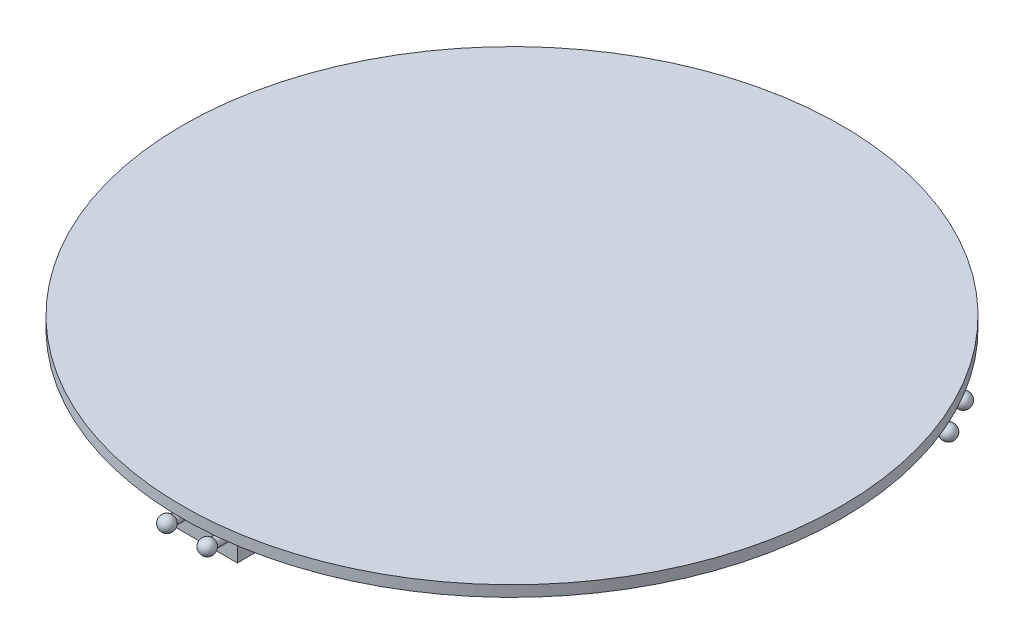
ISO-10303-21;
HEADER;
FILE_DESCRIPTION(('STEP AP214'),'2;1');
FILE_NAME('part.step','',(''),(''),'','','');
FILE_SCHEMA(('AUTOMOTIVE_DESIGN { 1 0 10303 214 1 1 1 1 }'));
ENDSEC;
DATA;
#1=APPLICATION_CONTEXT('core data for automotive mechanical design processes');
#2=APPLICATION_PROTOCOL_DEFINITION('international standard','automotive_design',2000,#1);
#3=PRODUCT_CONTEXT('',#1,'mechanical');
#4=PRODUCT('Part','Part','',(#3));
#5=PRODUCT_RELATED_PRODUCT_CATEGORY('part','',(#4));
#6=PRODUCT_DEFINITION_FORMATION('','',#4);
#7=PRODUCT_DEFINITION_CONTEXT('part definition',#1,'design');
#8=PRODUCT_DEFINITION('design','',#6,#7);
#9=PRODUCT_DEFINITION_SHAPE('','',#8);
#10=(LENGTH_UNIT() NAMED_UNIT(*) SI_UNIT(.MILLI.,.METRE.));
#11=(NAMED_UNIT(*) PLANE_ANGLE_UNIT() SI_UNIT($,.RADIAN.));
#12=(NAMED_UNIT(*) SI_UNIT($,.STERADIAN.) SOLID_ANGLE_UNIT());
#13=UNCERTAINTY_MEASURE_WITH_UNIT(LENGTH_MEASURE(1.E-05),#10,'distance_accuracy_value','');
#14=(GEOMETRIC_REPRESENTATION_CONTEXT(3) GLOBAL_UNCERTAINTY_ASSIGNED_CONTEXT((#13)) GLOBAL_UNIT_ASSIGNED_CONTEXT((#10,
#11,#12)) REPRESENTATION_CONTEXT('',''));
#15=CARTESIAN_POINT('',(0.,0.,0.));
#16=DIRECTION('',(0.,0.,1.));
#17=DIRECTION('',(1.,0.,0.));
#18=AXIS2_PLACEMENT_3D('',#15,#16,#17);
#19=CARTESIAN_POINT('',(0.,0.,0.));
#20=DIRECTION('',(0.,1.,0.));
#21=DIRECTION('',(1.,0.,0.));
#22=AXIS2_PLACEMENT_3D('',#19,#20,#21);
#23=PLANE('',#22);
#24=DIRECTION('',(0.,0.,-1.));
#25=VECTOR('',#24,1.);
#26=CARTESIAN_POINT('',(9.,0.,37.5));
#27=LINE('',#26,#25);
#28=CARTESIAN_POINT('',(9.,0.,84.));
#29=VERTEX_POINT('',#28);
#30=CARTESIAN_POINT('',(9.,0.,75.));
#31=VERTEX_POINT('',#30);
#32=EDGE_CURVE('E440',#29,#31,#27,.T.);
#33=ORIENTED_EDGE('',*,*,#32,.T.);
#34=DIRECTION('',(-1.,0.,0.));
#35=VECTOR('',#34,1.);
#36=CARTESIAN_POINT('',(-4.5,0.,75.));
#37=LINE('',#36,#35);
#38=CARTESIAN_POINT('',(-9.,0.,75.));
#39=VERTEX_POINT('',#38);
#40=EDGE_CURVE('E429',#31,#39,#37,.T.);
#41=ORIENTED_EDGE('',*,*,#40,.T.);
#42=DIRECTION('',(0.,0.,1.));
#43=VECTOR('',#42,1.);
#44=CARTESIAN_POINT('',(-9.,0.,42.));
#45=LINE('',#44,#43);
#46=CARTESIAN_POINT('',(-9.,0.,84.));
#47=VERTEX_POINT('',#46);
#48=EDGE_CURVE('E458',#39,#47,#45,.T.);
#49=ORIENTED_EDGE('',*,*,#48,.T.);
#50=DIRECTION('',(1.,0.,0.));
#51=VECTOR('',#50,1.);
#52=CARTESIAN_POINT('',(4.5,0.,84.));
#53=LINE('',#52,#51);
#54=EDGE_CURVE('E466',#47,#29,#53,.T.);
#55=ORIENTED_EDGE('',*,*,#54,.T.);
#56=EDGE_LOOP('',(#33,#41,#49,#55));
#57=FACE_BOUND('',#56,.T.);
#58=DIRECTION('',(-0.866025403784439,0.,-0.5));
#59=VECTOR('',#58,1.);
#60=CARTESIAN_POINT('',(-31.8730669589464,0.,-28.7942286340599));
#61=LINE('',#60,#59);
#62=CARTESIAN_POINT('',(-60.4519052838329,0.,-45.2942286340599));
#63=VERTEX_POINT('',#62);
#64=CARTESIAN_POINT('',(-68.2461339178929,0.,-49.7942286340599));
#65=VERTEX_POINT('',#64);
#66=EDGE_CURVE('E324',#63,#65,#61,.T.);
#67=ORIENTED_EDGE('',*,*,#66,.T.);
#68=DIRECTION('',(-0.5,0.,0.866025403784439));
#69=VECTOR('',#68,1.);
#70=CARTESIAN_POINT('',(-74.9961339178929,0.,-38.10288568297));
#71=LINE('',#70,#69);
#72=CARTESIAN_POINT('',(-77.2461339178929,0.,-34.20577136594));
#73=VERTEX_POINT('',#72);
#74=EDGE_CURVE('E403',#65,#73,#71,.T.);
#75=ORIENTED_EDGE('',*,*,#74,.T.);
#76=DIRECTION('',(0.866025403784439,0.,0.5));
#77=VECTOR('',#76,1.);
#78=CARTESIAN_POINT('',(-36.9759526419165,0.,-10.95577136594));
#79=LINE('',#78,#77);
#80=CARTESIAN_POINT('',(-69.4519052838329,0.,-29.70577136594));
#81=VERTEX_POINT('',#80);
#82=EDGE_CURVE('E411',#73,#81,#79,.T.);
#83=ORIENTED_EDGE('',*,*,#82,.T.);
#84=DIRECTION('',(0.5,0.,-0.866025403784439));
#85=VECTOR('',#84,1.);
#86=CARTESIAN_POINT('',(-62.7019052838329,0.,-41.3971143170299));
#87=LINE('',#86,#85);
#88=EDGE_CURVE('E422',#81,#63,#87,.T.);
#89=ORIENTED_EDGE('',*,*,#88,.T.);
#90=EDGE_LOOP('',(#67,#75,#83,#89));
#91=FACE_BOUND('',#90,.T.);
#92=DIRECTION('',(-0.866025403784439,0.,0.5));
#93=VECTOR('',#92,1.);
#94=CARTESIAN_POINT('',(27.9759526419163,0.,-26.5442286340602));
#95=LINE('',#94,#93);
#96=CARTESIAN_POINT('',(68.2461339178927,0.,-49.7942286340602));
#97=VERTEX_POINT('',#96);
#98=CARTESIAN_POINT('',(60.4519052838328,0.,-45.2942286340602));
#99=VERTEX_POINT('',#98);
#100=EDGE_CURVE('E342',#97,#99,#95,.T.);
#101=ORIENTED_EDGE('',*,*,#100,.T.);
#102=DIRECTION('',(0.5,0.,0.866025403784438));
#103=VECTOR('',#102,1.);
#104=CARTESIAN_POINT('',(67.2019052838329,0.,-33.60288568297));
#105=LINE('',#104,#103);
#106=CARTESIAN_POINT('',(69.4519052838329,0.,-29.70577136594));
#107=VERTEX_POINT('',#106);
#108=EDGE_CURVE('E358',#99,#107,#105,.T.);
#109=ORIENTED_EDGE('',*,*,#108,.T.);
#110=DIRECTION('',(0.866025403784439,0.,-0.5));
#111=VECTOR('',#110,1.);
#112=CARTESIAN_POINT('',(40.8730669589465,0.,-13.20577136594));
#113=LINE('',#112,#111);
#114=CARTESIAN_POINT('',(77.2461339178929,0.,-34.20577136594));
#115=VERTEX_POINT('',#114);
#116=EDGE_CURVE('E371',#107,#115,#113,.T.);
#117=ORIENTED_EDGE('',*,*,#116,.T.);
#118=DIRECTION('',(-0.5,0.,-0.866025403784438));
#119=VECTOR('',#118,1.);
#120=CARTESIAN_POINT('',(70.4961339178928,0.,-45.8971143170301));
#121=LINE('',#120,#119);
#122=EDGE_CURVE('E326',#115,#97,#121,.T.);
#123=ORIENTED_EDGE('',*,*,#122,.T.);
#124=EDGE_LOOP('',(#101,#109,#117,#123));
#125=FACE_BOUND('',#124,.T.);
#126=CARTESIAN_POINT('',(0.,0.,0.));
#127=DIRECTION('',(0.,1.,0.));
#128=DIRECTION('',(-1.,0.,0.));
#129=AXIS2_PLACEMENT_3D('',#126,#127,#128);
#130=CIRCLE('',#129,90.);
#131=CARTESIAN_POINT('',(90.,0.,0.));
#132=VERTEX_POINT('',#131);
#133=EDGE_CURVE('E11',#132,#132,#130,.T.);
#134=ORIENTED_EDGE('',*,*,#133,.F.);
#135=EDGE_LOOP('',(#134));
#136=FACE_BOUND('',#135,.T.);
#137=ADVANCED_FACE('F17',(#57,#91,#125,#136),#23,.F.);
#138=CARTESIAN_POINT('',(0.,3.,0.));
#139=DIRECTION('',(0.,1.,0.));
#140=DIRECTION('',(1.,0.,0.));
#141=AXIS2_PLACEMENT_3D('',#138,#139,#140);
#142=PLANE('',#141);
#143=CARTESIAN_POINT('',(0.,3.,0.));
#144=DIRECTION('',(0.,1.,0.));
#145=DIRECTION('',(-1.,0.,0.));
#146=AXIS2_PLACEMENT_3D('',#143,#144,#145);
#147=CIRCLE('',#146,90.);
#148=CARTESIAN_POINT('',(90.,3.,0.));
#149=VERTEX_POINT('',#148);
#150=EDGE_CURVE('E392',#149,#149,#147,.T.);
#151=ORIENTED_EDGE('',*,*,#150,.T.);
#152=EDGE_LOOP('',(#151));
#153=FACE_BOUND('',#152,.T.);
#154=ADVANCED_FACE('F476',(#153),#142,.T.);
#155=CARTESIAN_POINT('',(0.,0.,0.));
#156=DIRECTION('',(0.,1.,0.));
#157=DIRECTION('',(-1.,0.,0.));
#158=AXIS2_PLACEMENT_3D('',#155,#156,#157);
#159=CYLINDRICAL_SURFACE('',#158,90.);
#160=ORIENTED_EDGE('',*,*,#150,.F.);
#161=DIRECTION('',(0.,-1.,0.));
#162=VECTOR('',#161,1.);
#163=CARTESIAN_POINT('',(90.,0.,0.));
#164=LINE('',#163,#162);
#165=EDGE_CURVE('E25',#149,#132,#164,.T.);
#166=ORIENTED_EDGE('',*,*,#165,.T.);
#167=ORIENTED_EDGE('',*,*,#133,.T.);
#168=ORIENTED_EDGE('',*,*,#165,.F.);
#169=EDGE_LOOP('',(#160,#166,#167,#168));
#170=FACE_BOUND('',#169,.T.);
#171=ADVANCED_FACE('F478',(#170),#159,.T.);
#172=CARTESIAN_POINT('',(0.,-9.,79.5));
#173=DIRECTION('',(0.,-1.,0.));
#174=DIRECTION('',(0.,0.,-1.));
#175=AXIS2_PLACEMENT_3D('',#172,#173,#174);
#176=PLANE('',#175);
#177=DIRECTION('',(-1.,0.,0.));
#178=VECTOR('',#177,1.);
#179=CARTESIAN_POINT('',(-9.,-9.,84.));
#180=LINE('',#179,#178);
#181=CARTESIAN_POINT('',(9.,-9.,84.));
#182=VERTEX_POINT('',#181);
#183=CARTESIAN_POINT('',(-9.,-9.,84.));
#184=VERTEX_POINT('',#183);
#185=EDGE_CURVE('E395',#182,#184,#180,.T.);
#186=ORIENTED_EDGE('',*,*,#185,.T.);
#187=DIRECTION('',(0.,0.,-1.));
#188=VECTOR('',#187,1.);
#189=CARTESIAN_POINT('',(-9.,-9.,75.));
#190=LINE('',#189,#188);
#191=CARTESIAN_POINT('',(-9.,-9.,75.));
#192=VERTEX_POINT('',#191);
#193=EDGE_CURVE('E465',#184,#192,#190,.T.);
#194=ORIENTED_EDGE('',*,*,#193,.T.);
#195=DIRECTION('',(1.,0.,0.));
#196=VECTOR('',#195,1.);
#197=CARTESIAN_POINT('',(9.,-9.,75.));
#198=LINE('',#197,#196);
#199=CARTESIAN_POINT('',(9.,-9.,75.));
#200=VERTEX_POINT('',#199);
#201=EDGE_CURVE('E451',#192,#200,#198,.T.);
#202=ORIENTED_EDGE('',*,*,#201,.T.);
#203=DIRECTION('',(0.,0.,1.));
#204=VECTOR('',#203,1.);
#205=CARTESIAN_POINT('',(9.,-9.,84.));
#206=LINE('',#205,#204);
#207=EDGE_CURVE('E431',#200,#182,#206,.T.);
#208=ORIENTED_EDGE('',*,*,#207,.T.);
#209=EDGE_LOOP('',(#186,#194,#202,#208));
#210=FACE_BOUND('',#209,.T.);
#211=ADVANCED_FACE('F486',(#210),#176,.T.);
#212=CARTESIAN_POINT('',(9.,0.,84.));
#213=DIRECTION('',(0.,0.,1.));
#214=DIRECTION('',(1.,0.,0.));
#215=AXIS2_PLACEMENT_3D('',#212,#213,#214);
#216=PLANE('',#215);
#217=CARTESIAN_POINT('',(-5.5,-4.5,84.));
#218=DIRECTION('',(0.,0.,-1.));
#219=DIRECTION('',(1.,0.,0.));
#220=AXIS2_PLACEMENT_3D('',#217,#218,#219);
#221=CIRCLE('',#220,1.25);
#222=CARTESIAN_POINT('',(-6.75,-4.5,84.));
#223=VERTEX_POINT('',#222);
#224=EDGE_CURVE('E341',#223,#223,#221,.T.);
#225=ORIENTED_EDGE('',*,*,#224,.T.);
#226=EDGE_LOOP('',(#225));
#227=FACE_BOUND('',#226,.T.);
#228=CARTESIAN_POINT('',(5.5,-4.5,84.));
#229=DIRECTION('',(0.,0.,-1.));
#230=DIRECTION('',(1.,0.,0.));
#231=AXIS2_PLACEMENT_3D('',#228,#229,#230);
#232=CIRCLE('',#231,1.25);
#233=CARTESIAN_POINT('',(4.25,-4.5,84.));
#234=VERTEX_POINT('',#233);
#235=EDGE_CURVE('E331',#234,#234,#232,.T.);
#236=ORIENTED_EDGE('',*,*,#235,.T.);
#237=EDGE_LOOP('',(#236));
#238=FACE_BOUND('',#237,.T.);
#239=ORIENTED_EDGE('',*,*,#54,.F.);
#240=DIRECTION('',(0.,-1.,0.));
#241=VECTOR('',#240,1.);
#242=CARTESIAN_POINT('',(-9.,0.,84.));
#243=LINE('',#242,#241);
#244=EDGE_CURVE('E464',#47,#184,#243,.T.);
#245=ORIENTED_EDGE('',*,*,#244,.T.);
#246=ORIENTED_EDGE('',*,*,#185,.F.);
#247=DIRECTION('',(0.,-1.,0.));
#248=VECTOR('',#247,1.);
#249=CARTESIAN_POINT('',(9.,0.,84.));
#250=LINE('',#249,#248);
#251=EDGE_CURVE('E442',#29,#182,#250,.T.);
#252=ORIENTED_EDGE('',*,*,#251,.F.);
#253=EDGE_LOOP('',(#239,#245,#246,#252));
#254=FACE_BOUND('',#253,.T.);
#255=ADVANCED_FACE('F495',(#227,#238,#254),#216,.T.);
#256=CARTESIAN_POINT('',(-9.,0.,84.));
#257=DIRECTION('',(-1.,0.,0.));
#258=DIRECTION('',(0.,0.,1.));
#259=AXIS2_PLACEMENT_3D('',#256,#257,#258);
#260=PLANE('',#259);
#261=ORIENTED_EDGE('',*,*,#48,.F.);
#262=DIRECTION('',(0.,-1.,0.));
#263=VECTOR('',#262,1.);
#264=CARTESIAN_POINT('',(-9.,0.,75.));
#265=LINE('',#264,#263);
#266=EDGE_CURVE('E452',#39,#192,#265,.T.);
#267=ORIENTED_EDGE('',*,*,#266,.T.);
#268=ORIENTED_EDGE('',*,*,#193,.F.);
#269=ORIENTED_EDGE('',*,*,#244,.F.);
#270=EDGE_LOOP('',(#261,#267,#268,#269));
#271=FACE_BOUND('',#270,.T.);
#272=ADVANCED_FACE('F497',(#271),#260,.T.);
#273=CARTESIAN_POINT('',(-9.,0.,75.));
#274=DIRECTION('',(0.,0.,-1.));
#275=DIRECTION('',(0.,-1.,0.));
#276=AXIS2_PLACEMENT_3D('',#273,#274,#275);
#277=PLANE('',#276);
#278=ORIENTED_EDGE('',*,*,#40,.F.);
#279=DIRECTION('',(0.,-1.,0.));
#280=VECTOR('',#279,1.);
#281=CARTESIAN_POINT('',(9.,0.,75.));
#282=LINE('',#281,#280);
#283=EDGE_CURVE('E426',#31,#200,#282,.T.);
#284=ORIENTED_EDGE('',*,*,#283,.T.);
#285=ORIENTED_EDGE('',*,*,#201,.F.);
#286=ORIENTED_EDGE('',*,*,#266,.F.);
#287=EDGE_LOOP('',(#278,#284,#285,#286));
#288=FACE_BOUND('',#287,.T.);
#289=ADVANCED_FACE('F498',(#288),#277,.T.);
#290=CARTESIAN_POINT('',(9.,0.,75.));
#291=DIRECTION('',(1.,0.,0.));
#292=DIRECTION('',(0.,1.,0.));
#293=AXIS2_PLACEMENT_3D('',#290,#291,#292);
#294=PLANE('',#293);
#295=ORIENTED_EDGE('',*,*,#32,.F.);
#296=ORIENTED_EDGE('',*,*,#251,.T.);
#297=ORIENTED_EDGE('',*,*,#207,.F.);
#298=ORIENTED_EDGE('',*,*,#283,.F.);
#299=EDGE_LOOP('',(#295,#296,#297,#298));
#300=FACE_BOUND('',#299,.T.);
#301=ADVANCED_FACE('F503',(#300),#294,.T.);
#302=CARTESIAN_POINT('',(-68.8490196008629,-9.,-39.75));
#303=DIRECTION('',(0.,-1.,0.));
#304=DIRECTION('',(0.,0.,-1.));
#305=AXIS2_PLACEMENT_3D('',#302,#303,#304);
#306=PLANE('',#305);
#307=DIRECTION('',(-0.5,0.,0.866025403784439));
#308=VECTOR('',#307,1.);
#309=CARTESIAN_POINT('',(-69.4519052838329,-9.,-29.70577136594));
#310=LINE('',#309,#308);
#311=CARTESIAN_POINT('',(-60.4519052838329,-9.,-45.2942286340599));
#312=VERTEX_POINT('',#311);
#313=CARTESIAN_POINT('',(-69.4519052838329,-9.,-29.70577136594));
#314=VERTEX_POINT('',#313);
#315=EDGE_CURVE('E432',#312,#314,#310,.T.);
#316=ORIENTED_EDGE('',*,*,#315,.T.);
#317=DIRECTION('',(-0.866025403784439,0.,-0.5));
#318=VECTOR('',#317,1.);
#319=CARTESIAN_POINT('',(-77.2461339178929,-9.,-34.20577136594));
#320=LINE('',#319,#318);
#321=CARTESIAN_POINT('',(-77.2461339178929,-9.,-34.20577136594));
#322=VERTEX_POINT('',#321);
#323=EDGE_CURVE('E416',#314,#322,#320,.T.);
#324=ORIENTED_EDGE('',*,*,#323,.T.);
#325=DIRECTION('',(0.5,0.,-0.866025403784439));
#326=VECTOR('',#325,1.);
#327=CARTESIAN_POINT('',(-68.2461339178929,-9.,-49.7942286340599));
#328=LINE('',#327,#326);
#329=CARTESIAN_POINT('',(-68.2461339178929,-9.,-49.7942286340599));
#330=VERTEX_POINT('',#329);
#331=EDGE_CURVE('E410',#322,#330,#328,.T.);
#332=ORIENTED_EDGE('',*,*,#331,.T.);
#333=DIRECTION('',(0.866025403784439,0.,0.5));
#334=VECTOR('',#333,1.);
#335=CARTESIAN_POINT('',(-60.4519052838329,-9.,-45.2942286340599));
#336=LINE('',#335,#334);
#337=EDGE_CURVE('E391',#330,#312,#336,.T.);
#338=ORIENTED_EDGE('',*,*,#337,.T.);
#339=EDGE_LOOP('',(#316,#324,#332,#338));
#340=FACE_BOUND('',#339,.T.);
#341=ADVANCED_FACE('F508',(#340),#306,.T.);
#342=CARTESIAN_POINT('',(-60.4519052838329,0.,-45.2942286340599));
#343=DIRECTION('',(0.866025403784439,0.,0.5));
#344=DIRECTION('',(0.,-1.,0.));
#345=AXIS2_PLACEMENT_3D('',#342,#343,#344);
#346=PLANE('',#345);
#347=ORIENTED_EDGE('',*,*,#88,.F.);
#348=DIRECTION('',(0.,-1.,0.));
#349=VECTOR('',#348,1.);
#350=CARTESIAN_POINT('',(-69.4519052838329,0.,-29.70577136594));
#351=LINE('',#350,#349);
#352=EDGE_CURVE('E423',#81,#314,#351,.T.);
#353=ORIENTED_EDGE('',*,*,#352,.T.);
#354=ORIENTED_EDGE('',*,*,#315,.F.);
#355=DIRECTION('',(0.,-1.,0.));
#356=VECTOR('',#355,1.);
#357=CARTESIAN_POINT('',(-60.4519052838329,0.,-45.2942286340599));
#358=LINE('',#357,#356);
#359=EDGE_CURVE('E390',#63,#312,#358,.T.);
#360=ORIENTED_EDGE('',*,*,#359,.F.);
#361=EDGE_LOOP('',(#347,#353,#354,#360));
#362=FACE_BOUND('',#361,.T.);
#363=ADVANCED_FACE('F511',(#362),#346,.T.);
#364=CARTESIAN_POINT('',(-69.4519052838329,0.,-29.70577136594));
#365=DIRECTION('',(-0.5,0.,0.866025403784439));
#366=DIRECTION('',(0.,1.,0.));
#367=AXIS2_PLACEMENT_3D('',#364,#365,#366);
#368=PLANE('',#367);
#369=ORIENTED_EDGE('',*,*,#82,.F.);
#370=DIRECTION('',(0.,-1.,0.));
#371=VECTOR('',#370,1.);
#372=CARTESIAN_POINT('',(-77.2461339178929,0.,-34.20577136594));
#373=LINE('',#372,#371);
#374=EDGE_CURVE('E409',#73,#322,#373,.T.);
#375=ORIENTED_EDGE('',*,*,#374,.T.);
#376=ORIENTED_EDGE('',*,*,#323,.F.);
#377=ORIENTED_EDGE('',*,*,#352,.F.);
#378=EDGE_LOOP('',(#369,#375,#376,#377));
#379=FACE_BOUND('',#378,.T.);
#380=ADVANCED_FACE('F516',(#379),#368,.T.);
#381=CARTESIAN_POINT('',(-77.2461339178929,0.,-34.20577136594));
#382=DIRECTION('',(-0.866025403784439,0.,-0.5));
#383=DIRECTION('',(-0.5,0.,0.866025403784439));
#384=AXIS2_PLACEMENT_3D('',#381,#382,#383);
#385=PLANE('',#384);
#386=CARTESIAN_POINT('',(-69.9961339178928,-4.5,-46.7631397208144));
#387=DIRECTION('',(0.866025403784439,0.,0.5));
#388=DIRECTION('',(-0.5,0.,0.866025403784439));
#389=AXIS2_PLACEMENT_3D('',#386,#387,#388);
#390=CIRCLE('',#389,1.25);
#391=CARTESIAN_POINT('',(-69.3711339178928,-4.5,-47.8456714755449));
#392=VERTEX_POINT('',#391);
#393=EDGE_CURVE('E270',#392,#392,#390,.T.);
#394=ORIENTED_EDGE('',*,*,#393,.T.);
#395=EDGE_LOOP('',(#394));
#396=FACE_BOUND('',#395,.T.);
#397=CARTESIAN_POINT('',(-75.4961339178929,-4.5,-37.2368602791855));
#398=DIRECTION('',(0.866025403784439,0.,0.5));
#399=DIRECTION('',(-0.5,0.,0.866025403784439));
#400=AXIS2_PLACEMENT_3D('',#397,#398,#399);
#401=CIRCLE('',#400,1.25);
#402=CARTESIAN_POINT('',(-74.8711339178929,-4.5,-38.3193920339161));
#403=VERTEX_POINT('',#402);
#404=EDGE_CURVE('E253',#403,#403,#401,.T.);
#405=ORIENTED_EDGE('',*,*,#404,.T.);
#406=EDGE_LOOP('',(#405));
#407=FACE_BOUND('',#406,.T.);
#408=ORIENTED_EDGE('',*,*,#74,.F.);
#409=DIRECTION('',(0.,-1.,0.));
#410=VECTOR('',#409,1.);
#411=CARTESIAN_POINT('',(-68.2461339178929,0.,-49.7942286340599));
#412=LINE('',#411,#410);
#413=EDGE_CURVE('E397',#65,#330,#412,.T.);
#414=ORIENTED_EDGE('',*,*,#413,.T.);
#415=ORIENTED_EDGE('',*,*,#331,.F.);
#416=ORIENTED_EDGE('',*,*,#374,.F.);
#417=EDGE_LOOP('',(#408,#414,#415,#416));
#418=FACE_BOUND('',#417,.T.);
#419=ADVANCED_FACE('F519',(#396,#407,#418),#385,.T.);
#420=CARTESIAN_POINT('',(-68.2461339178929,0.,-49.7942286340599));
#421=DIRECTION('',(0.5,0.,-0.866025403784439));
#422=DIRECTION('',(0.,-1.,0.));
#423=AXIS2_PLACEMENT_3D('',#420,#421,#422);
#424=PLANE('',#423);
#425=ORIENTED_EDGE('',*,*,#66,.F.);
#426=ORIENTED_EDGE('',*,*,#359,.T.);
#427=ORIENTED_EDGE('',*,*,#337,.F.);
#428=ORIENTED_EDGE('',*,*,#413,.F.);
#429=EDGE_LOOP('',(#425,#426,#427,#428));
#430=FACE_BOUND('',#429,.T.);
#431=ADVANCED_FACE('F521',(#430),#424,.T.);
#432=CARTESIAN_POINT('',(68.8490196008628,-9.,-39.75));
#433=DIRECTION('',(0.,-1.,0.));
#434=DIRECTION('',(0.,0.,-1.));
#435=AXIS2_PLACEMENT_3D('',#432,#433,#434);
#436=PLANE('',#435);
#437=DIRECTION('',(0.5,0.,0.866025403784438));
#438=VECTOR('',#437,1.);
#439=CARTESIAN_POINT('',(77.2461339178929,-9.,-34.20577136594));
#440=LINE('',#439,#438);
#441=CARTESIAN_POINT('',(68.2461339178927,-9.,-49.7942286340602));
#442=VERTEX_POINT('',#441);
#443=CARTESIAN_POINT('',(77.2461339178929,-9.,-34.20577136594));
#444=VERTEX_POINT('',#443);
#445=EDGE_CURVE('E325',#442,#444,#440,.T.);
#446=ORIENTED_EDGE('',*,*,#445,.T.);
#447=DIRECTION('',(-0.866025403784439,0.,0.5));
#448=VECTOR('',#447,1.);
#449=CARTESIAN_POINT('',(69.4519052838329,-9.,-29.70577136594));
#450=LINE('',#449,#448);
#451=CARTESIAN_POINT('',(69.4519052838329,-9.,-29.70577136594));
#452=VERTEX_POINT('',#451);
#453=EDGE_CURVE('E374',#444,#452,#450,.T.);
#454=ORIENTED_EDGE('',*,*,#453,.T.);
#455=DIRECTION('',(-0.5,0.,-0.866025403784438));
#456=VECTOR('',#455,1.);
#457=CARTESIAN_POINT('',(60.4519052838328,-9.,-45.2942286340602));
#458=LINE('',#457,#456);
#459=CARTESIAN_POINT('',(60.4519052838328,-9.,-45.2942286340602));
#460=VERTEX_POINT('',#459);
#461=EDGE_CURVE('E365',#452,#460,#458,.T.);
#462=ORIENTED_EDGE('',*,*,#461,.T.);
#463=DIRECTION('',(0.866025403784439,0.,-0.5));
#464=VECTOR('',#463,1.);
#465=CARTESIAN_POINT('',(68.2461339178927,-9.,-49.7942286340602));
#466=LINE('',#465,#464);
#467=EDGE_CURVE('E355',#460,#442,#466,.T.);
#468=ORIENTED_EDGE('',*,*,#467,.T.);
#469=EDGE_LOOP('',(#446,#454,#462,#468));
#470=FACE_BOUND('',#469,.T.);
#471=ADVANCED_FACE('F526',(#470),#436,.T.);
#472=CARTESIAN_POINT('',(68.2461339178927,0.,-49.7942286340602));
#473=DIRECTION('',(0.866025403784438,0.,-0.5));
#474=DIRECTION('',(0.,-1.,0.));
#475=AXIS2_PLACEMENT_3D('',#472,#473,#474);
#476=PLANE('',#475);
#477=CARTESIAN_POINT('',(75.4961339178928,-4.5,-37.2368602791857));
#478=DIRECTION('',(-0.866025403784439,0.,0.5));
#479=DIRECTION('',(-0.5,0.,-0.866025403784439));
#480=AXIS2_PLACEMENT_3D('',#477,#478,#479);
#481=CIRCLE('',#480,1.25);
#482=CARTESIAN_POINT('',(76.1211339178928,-4.5,-36.1543285244551));
#483=VERTEX_POINT('',#482);
#484=EDGE_CURVE('E308',#483,#483,#481,.T.);
#485=ORIENTED_EDGE('',*,*,#484,.T.);
#486=EDGE_LOOP('',(#485));
#487=FACE_BOUND('',#486,.T.);
#488=CARTESIAN_POINT('',(69.9961339178928,-4.5,-46.7631397208145));
#489=DIRECTION('',(-0.866025403784439,0.,0.5));
#490=DIRECTION('',(-0.5,0.,-0.866025403784439));
#491=AXIS2_PLACEMENT_3D('',#488,#489,#490);
#492=CIRCLE('',#491,1.25);
#493=CARTESIAN_POINT('',(70.6211339178928,-4.5,-45.6806079660839));
#494=VERTEX_POINT('',#493);
#495=EDGE_CURVE('E298',#494,#494,#492,.T.);
#496=ORIENTED_EDGE('',*,*,#495,.T.);
#497=EDGE_LOOP('',(#496));
#498=FACE_BOUND('',#497,.T.);
#499=ORIENTED_EDGE('',*,*,#122,.F.);
#500=DIRECTION('',(0.,-1.,0.));
#501=VECTOR('',#500,1.);
#502=CARTESIAN_POINT('',(77.2461339178929,0.,-34.20577136594));
#503=LINE('',#502,#501);
#504=EDGE_CURVE('E378',#115,#444,#503,.T.);
#505=ORIENTED_EDGE('',*,*,#504,.T.);
#506=ORIENTED_EDGE('',*,*,#445,.F.);
#507=DIRECTION('',(0.,-1.,0.));
#508=VECTOR('',#507,1.);
#509=CARTESIAN_POINT('',(68.2461339178927,0.,-49.7942286340602));
#510=LINE('',#509,#508);
#511=EDGE_CURVE('E348',#97,#442,#510,.T.);
#512=ORIENTED_EDGE('',*,*,#511,.F.);
#513=EDGE_LOOP('',(#499,#505,#506,#512));
#514=FACE_BOUND('',#513,.T.);
#515=ADVANCED_FACE('F535',(#487,#498,#514),#476,.T.);
#516=CARTESIAN_POINT('',(77.2461339178929,0.,-34.20577136594));
#517=DIRECTION('',(0.5,0.,0.866025403784438));
#518=DIRECTION('',(0.,-1.,0.));
#519=AXIS2_PLACEMENT_3D('',#516,#517,#518);
#520=PLANE('',#519);
#521=ORIENTED_EDGE('',*,*,#116,.F.);
#522=DIRECTION('',(0.,-1.,0.));
#523=VECTOR('',#522,1.);
#524=CARTESIAN_POINT('',(69.4519052838329,0.,-29.70577136594));
#525=LINE('',#524,#523);
#526=EDGE_CURVE('E370',#107,#452,#525,.T.);
#527=ORIENTED_EDGE('',*,*,#526,.T.);
#528=ORIENTED_EDGE('',*,*,#453,.F.);
#529=ORIENTED_EDGE('',*,*,#504,.F.);
#530=EDGE_LOOP('',(#521,#527,#528,#529));
#531=FACE_BOUND('',#530,.T.);
#532=ADVANCED_FACE('F534',(#531),#520,.T.);
#533=CARTESIAN_POINT('',(69.4519052838329,0.,-29.70577136594));
#534=DIRECTION('',(-0.866025403784438,0.,0.5));
#535=DIRECTION('',(0.,1.,0.));
#536=AXIS2_PLACEMENT_3D('',#533,#534,#535);
#537=PLANE('',#536);
#538=ORIENTED_EDGE('',*,*,#108,.F.);
#539=DIRECTION('',(0.,-1.,0.));
#540=VECTOR('',#539,1.);
#541=CARTESIAN_POINT('',(60.4519052838328,0.,-45.2942286340602));
#542=LINE('',#541,#540);
#543=EDGE_CURVE('E357',#99,#460,#542,.T.);
#544=ORIENTED_EDGE('',*,*,#543,.T.);
#545=ORIENTED_EDGE('',*,*,#461,.F.);
#546=ORIENTED_EDGE('',*,*,#526,.F.);
#547=EDGE_LOOP('',(#538,#544,#545,#546));
#548=FACE_BOUND('',#547,.T.);
#549=ADVANCED_FACE('F540',(#548),#537,.T.);
#550=CARTESIAN_POINT('',(60.4519052838328,0.,-45.2942286340602));
#551=DIRECTION('',(-0.5,0.,-0.866025403784438));
#552=DIRECTION('',(-0.866025403784438,0.,0.5));
#553=AXIS2_PLACEMENT_3D('',#550,#551,#552);
#554=PLANE('',#553);
#555=ORIENTED_EDGE('',*,*,#100,.F.);
#556=ORIENTED_EDGE('',*,*,#511,.T.);
#557=ORIENTED_EDGE('',*,*,#467,.F.);
#558=ORIENTED_EDGE('',*,*,#543,.F.);
#559=EDGE_LOOP('',(#555,#556,#557,#558));
#560=FACE_BOUND('',#559,.T.);
#561=ADVANCED_FACE('F546',(#560),#554,.T.);
#562=CARTESIAN_POINT('',(-5.5,-4.5,84.));
#563=DIRECTION('',(0.,0.,1.));
#564=DIRECTION('',(1.,0.,0.));
#565=AXIS2_PLACEMENT_3D('',#562,#563,#564);
#566=CYLINDRICAL_SURFACE('',#565,1.25);
#567=CARTESIAN_POINT('',(-5.5,-4.5,87.1707505004004));
#568=DIRECTION('',(0.,0.,-1.));
#569=DIRECTION('',(1.,0.,0.));
#570=AXIS2_PLACEMENT_3D('',#567,#568,#569);
#571=CIRCLE('',#570,1.25);
#572=CARTESIAN_POINT('',(-6.75,-4.5,87.1707505004004));
#573=VERTEX_POINT('',#572);
#574=EDGE_CURVE('E320',#573,#573,#571,.T.);
#575=ORIENTED_EDGE('',*,*,#574,.T.);
#576=DIRECTION('',(0.,0.,-1.));
#577=VECTOR('',#576,1.);
#578=CARTESIAN_POINT('',(-6.75,-4.5,84.));
#579=LINE('',#578,#577);
#580=EDGE_CURVE('E337',#573,#223,#579,.T.);
#581=ORIENTED_EDGE('',*,*,#580,.T.);
#582=ORIENTED_EDGE('',*,*,#224,.F.);
#583=ORIENTED_EDGE('',*,*,#580,.F.);
#584=EDGE_LOOP('',(#575,#581,#582,#583));
#585=FACE_BOUND('',#584,.T.);
#586=ADVANCED_FACE('F545',(#585),#566,.T.);
#587=CARTESIAN_POINT('',(5.5,-4.5,84.));
#588=DIRECTION('',(0.,0.,1.));
#589=DIRECTION('',(1.,0.,0.));
#590=AXIS2_PLACEMENT_3D('',#587,#588,#589);
#591=CYLINDRICAL_SURFACE('',#590,1.25);
#592=CARTESIAN_POINT('',(5.5,-4.5,87.1707505004004));
#593=DIRECTION('',(0.,0.,-1.));
#594=DIRECTION('',(1.,0.,0.));
#595=AXIS2_PLACEMENT_3D('',#592,#593,#594);
#596=CIRCLE('',#595,1.25);
#597=CARTESIAN_POINT('',(4.25,-4.5,87.1707505004004));
#598=VERTEX_POINT('',#597);
#599=EDGE_CURVE('E310',#598,#598,#596,.T.);
#600=ORIENTED_EDGE('',*,*,#599,.T.);
#601=DIRECTION('',(0.,0.,-1.));
#602=VECTOR('',#601,1.);
#603=CARTESIAN_POINT('',(4.25,-4.5,84.));
#604=LINE('',#603,#602);
#605=EDGE_CURVE('E329',#598,#234,#604,.T.);
#606=ORIENTED_EDGE('',*,*,#605,.T.);
#607=ORIENTED_EDGE('',*,*,#235,.F.);
#608=ORIENTED_EDGE('',*,*,#605,.F.);
#609=EDGE_LOOP('',(#600,#606,#607,#608));
#610=FACE_BOUND('',#609,.T.);
#611=ADVANCED_FACE('F544',(#610),#591,.T.);
#612=CARTESIAN_POINT('',(-5.5,-4.5,88.732));
#613=DIRECTION('',(0.,0.,1.));
#614=DIRECTION('',(1.,0.,0.));
#615=AXIS2_PLACEMENT_3D('',#612,#613,#614);
#616=SPHERICAL_SURFACE('',#615,2.);
#617=ORIENTED_EDGE('',*,*,#574,.F.);
#618=CARTESIAN_POINT('',(-5.5,-4.5,88.732));
#619=DIRECTION('',(0.,-1.,0.));
#620=DIRECTION('',(-1.,0.,0.));
#621=AXIS2_PLACEMENT_3D('',#618,#619,#620);
#622=CIRCLE('',#621,2.);
#623=CARTESIAN_POINT('',(-5.5,-4.5,90.732));
#624=VERTEX_POINT('',#623);
#625=EDGE_CURVE('E321',#624,#573,#622,.T.);
#626=ORIENTED_EDGE('',*,*,#625,.F.);
#627=ORIENTED_EDGE('',*,*,#625,.T.);
#628=EDGE_LOOP('',(#617,#626,#627));
#629=FACE_BOUND('',#628,.T.);
#630=ADVANCED_FACE('F547',(#629),#616,.T.);
#631=CARTESIAN_POINT('',(5.5,-4.5,88.732));
#632=DIRECTION('',(0.,0.,1.));
#633=DIRECTION('',(1.,0.,0.));
#634=AXIS2_PLACEMENT_3D('',#631,#632,#633);
#635=SPHERICAL_SURFACE('',#634,2.);
#636=ORIENTED_EDGE('',*,*,#599,.F.);
#637=CARTESIAN_POINT('',(5.5,-4.5,88.732));
#638=DIRECTION('',(0.,-1.,0.));
#639=DIRECTION('',(-1.,0.,0.));
#640=AXIS2_PLACEMENT_3D('',#637,#638,#639);
#641=CIRCLE('',#640,2.);
#642=CARTESIAN_POINT('',(5.5,-4.5,90.732));
#643=VERTEX_POINT('',#642);
#644=EDGE_CURVE('E311',#643,#598,#641,.T.);
#645=ORIENTED_EDGE('',*,*,#644,.F.);
#646=ORIENTED_EDGE('',*,*,#644,.T.);
#647=EDGE_LOOP('',(#636,#645,#646));
#648=FACE_BOUND('',#647,.T.);
#649=ADVANCED_FACE('F552',(#648),#635,.T.);
#650=CARTESIAN_POINT('',(75.4961339178928,-4.5,-37.2368602791857));
#651=DIRECTION('',(0.866025403784439,0.,-0.5));
#652=DIRECTION('',(-0.5,0.,-0.866025403784439));
#653=AXIS2_PLACEMENT_3D('',#650,#651,#652);
#654=CYLINDRICAL_SURFACE('',#653,1.25);
#655=CARTESIAN_POINT('',(78.2420844003017,-4.5,-38.8222355293859));
#656=DIRECTION('',(-0.866025403784438,0.,0.5));
#657=DIRECTION('',(-0.5,0.,-0.866025403784438));
#658=AXIS2_PLACEMENT_3D('',#655,#656,#657);
#659=CIRCLE('',#658,1.25);
#660=CARTESIAN_POINT('',(78.8670844003017,-4.5,-37.7397037746553));
#661=VERTEX_POINT('',#660);
#662=CARTESIAN_POINT('',(77.6170844003017,-4.5,-39.9047672841164));
#663=VERTEX_POINT('',#662);
#664=EDGE_CURVE('E271',#661,#663,#659,.T.);
#665=ORIENTED_EDGE('',*,*,#664,.T.);
#666=CARTESIAN_POINT('',(78.2420844003017,-4.5,-38.8222355293859));
#667=DIRECTION('',(-0.866025403784438,0.,0.5));
#668=DIRECTION('',(-0.5,0.,-0.866025403784438));
#669=AXIS2_PLACEMENT_3D('',#666,#667,#668);
#670=CIRCLE('',#669,1.25);
#671=EDGE_CURVE('E266',#663,#661,#670,.T.);
#672=ORIENTED_EDGE('',*,*,#671,.T.);
#673=DIRECTION('',(-0.866025403784439,0.,0.5));
#674=VECTOR('',#673,1.);
#675=CARTESIAN_POINT('',(76.1211339178928,-4.5,-36.1543285244551));
#676=LINE('',#675,#674);
#677=EDGE_CURVE('E305',#661,#483,#676,.T.);
#678=ORIENTED_EDGE('',*,*,#677,.T.);
#679=ORIENTED_EDGE('',*,*,#484,.F.);
#680=ORIENTED_EDGE('',*,*,#677,.F.);
#681=EDGE_LOOP('',(#665,#672,#678,#679,#680));
#682=FACE_BOUND('',#681,.T.);
#683=ADVANCED_FACE('F553',(#682),#654,.T.);
#684=CARTESIAN_POINT('',(69.9961339178928,-4.5,-46.7631397208145));
#685=DIRECTION('',(0.866025403784439,0.,-0.5));
#686=DIRECTION('',(-0.5,0.,-0.866025403784439));
#687=AXIS2_PLACEMENT_3D('',#684,#685,#686);
#688=CYLINDRICAL_SURFACE('',#687,1.25);
#689=CARTESIAN_POINT('',(72.7420844003017,-4.5,-48.3485149710147));
#690=DIRECTION('',(-0.866025403784439,0.,0.5));
#691=DIRECTION('',(-0.5,0.,-0.866025403784439));
#692=AXIS2_PLACEMENT_3D('',#689,#690,#691);
#693=CIRCLE('',#692,1.25);
#694=CARTESIAN_POINT('',(73.3670844003017,-4.5,-47.2659832162841));
#695=VERTEX_POINT('',#694);
#696=CARTESIAN_POINT('',(72.1170844003017,-4.5,-49.4310467257452));
#697=VERTEX_POINT('',#696);
#698=EDGE_CURVE('E269',#695,#697,#693,.T.);
#699=ORIENTED_EDGE('',*,*,#698,.T.);
#700=CARTESIAN_POINT('',(72.7420844003017,-4.5,-48.3485149710147));
#701=DIRECTION('',(-0.866025403784439,0.,0.5));
#702=DIRECTION('',(-0.5,0.,-0.866025403784439));
#703=AXIS2_PLACEMENT_3D('',#700,#701,#702);
#704=CIRCLE('',#703,1.25);
#705=EDGE_CURVE('E290',#697,#695,#704,.T.);
#706=ORIENTED_EDGE('',*,*,#705,.T.);
#707=DIRECTION('',(-0.866025403784439,0.,0.5));
#708=VECTOR('',#707,1.);
#709=CARTESIAN_POINT('',(70.6211339178928,-4.5,-45.680607966084));
#710=LINE('',#709,#708);
#711=EDGE_CURVE('E264',#695,#494,#710,.T.);
#712=ORIENTED_EDGE('',*,*,#711,.T.);
#713=ORIENTED_EDGE('',*,*,#495,.F.);
#714=ORIENTED_EDGE('',*,*,#711,.F.);
#715=EDGE_LOOP('',(#699,#706,#712,#713,#714));
#716=FACE_BOUND('',#715,.T.);
#717=ADVANCED_FACE('F565',(#716),#688,.T.);
#718=CARTESIAN_POINT('',(79.5941661286008,-4.5,-39.6028602791857));
#719=DIRECTION('',(0.,0.,1.));
#720=DIRECTION('',(1.,0.,0.));
#721=AXIS2_PLACEMENT_3D('',#718,#719,#720);
#722=SPHERICAL_SURFACE('',#721,2.);
#723=ORIENTED_EDGE('',*,*,#664,.F.);
#724=CARTESIAN_POINT('',(79.5941661286008,-4.5,-39.6028602791857));
#725=DIRECTION('',(0.,-1.,0.));
#726=DIRECTION('',(-1.,0.,0.));
#727=AXIS2_PLACEMENT_3D('',#724,#725,#726);
#728=CIRCLE('',#727,2.);
#729=CARTESIAN_POINT('',(79.5941661286008,-4.5,-37.6028602791857));
#730=VERTEX_POINT('',#729);
#731=EDGE_CURVE('E274',#730,#661,#728,.T.);
#732=ORIENTED_EDGE('',*,*,#731,.F.);
#733=ORIENTED_EDGE('',*,*,#731,.T.);
#734=ORIENTED_EDGE('',*,*,#671,.F.);
#735=CARTESIAN_POINT('',(79.5941661286008,-4.5,-39.6028602791857));
#736=DIRECTION('',(0.,-1.,0.));
#737=DIRECTION('',(-1.,0.,0.));
#738=AXIS2_PLACEMENT_3D('',#735,#736,#737);
#739=CIRCLE('',#738,2.);
#740=CARTESIAN_POINT('',(79.5941661286008,-4.5,-41.6028602791857));
#741=VERTEX_POINT('',#740);
#742=EDGE_CURVE('E265',#663,#741,#739,.T.);
#743=ORIENTED_EDGE('',*,*,#742,.T.);
#744=ORIENTED_EDGE('',*,*,#742,.F.);
#745=EDGE_LOOP('',(#723,#732,#733,#734,#743,#744));
#746=FACE_BOUND('',#745,.T.);
#747=ADVANCED_FACE('F573',(#746),#722,.T.);
#748=CARTESIAN_POINT('',(74.0941661286007,-4.5,-49.1291397208145));
#749=DIRECTION('',(0.,0.,1.));
#750=DIRECTION('',(1.,0.,0.));
#751=AXIS2_PLACEMENT_3D('',#748,#749,#750);
#752=SPHERICAL_SURFACE('',#751,2.);
#753=ORIENTED_EDGE('',*,*,#698,.F.);
#754=CARTESIAN_POINT('',(74.0941661286007,-4.5,-49.1291397208145));
#755=DIRECTION('',(0.,-1.,0.));
#756=DIRECTION('',(-1.,0.,0.));
#757=AXIS2_PLACEMENT_3D('',#754,#755,#756);
#758=CIRCLE('',#757,2.);
#759=CARTESIAN_POINT('',(74.0941661286007,-4.5,-47.1291397208145));
#760=VERTEX_POINT('',#759);
#761=EDGE_CURVE('E278',#760,#695,#758,.T.);
#762=ORIENTED_EDGE('',*,*,#761,.F.);
#763=ORIENTED_EDGE('',*,*,#761,.T.);
#764=ORIENTED_EDGE('',*,*,#705,.F.);
#765=CARTESIAN_POINT('',(74.0941661286007,-4.5,-49.1291397208145));
#766=DIRECTION('',(0.,-1.,0.));
#767=DIRECTION('',(-1.,0.,0.));
#768=AXIS2_PLACEMENT_3D('',#765,#766,#767);
#769=CIRCLE('',#768,2.);
#770=CARTESIAN_POINT('',(74.0941661286007,-4.5,-51.1291397208145));
#771=VERTEX_POINT('',#770);
#772=EDGE_CURVE('E277',#697,#771,#769,.T.);
#773=ORIENTED_EDGE('',*,*,#772,.T.);
#774=ORIENTED_EDGE('',*,*,#772,.F.);
#775=EDGE_LOOP('',(#753,#762,#763,#764,#773,#774));
#776=FACE_BOUND('',#775,.T.);
#777=ADVANCED_FACE('F569',(#776),#752,.T.);
#778=CARTESIAN_POINT('',(-69.9961339178929,-4.5,-46.7631397208144));
#779=DIRECTION('',(-0.866025403784439,0.,-0.5));
#780=DIRECTION('',(-0.5,0.,0.866025403784439));
#781=AXIS2_PLACEMENT_3D('',#778,#779,#780);
#782=CYLINDRICAL_SURFACE('',#781,1.25);
#783=CARTESIAN_POINT('',(-72.7420844003018,-4.5,-48.3485149710146));
#784=DIRECTION('',(0.866025403784439,0.,0.5));
#785=DIRECTION('',(-0.5,0.,0.866025403784439));
#786=AXIS2_PLACEMENT_3D('',#783,#784,#785);
#787=CIRCLE('',#786,1.25);
#788=CARTESIAN_POINT('',(-72.1170844003018,-4.5,-49.4310467257451));
#789=VERTEX_POINT('',#788);
#790=EDGE_CURVE('E248',#789,#789,#787,.T.);
#791=ORIENTED_EDGE('',*,*,#790,.T.);
#792=DIRECTION('',(0.866025403784439,0.,0.5));
#793=VECTOR('',#792,1.);
#794=CARTESIAN_POINT('',(-69.3711339178929,-4.5,-47.8456714755449));
#795=LINE('',#794,#793);
#796=EDGE_CURVE('E255',#789,#392,#795,.T.);
#797=ORIENTED_EDGE('',*,*,#796,.T.);
#798=ORIENTED_EDGE('',*,*,#393,.F.);
#799=ORIENTED_EDGE('',*,*,#796,.F.);
#800=EDGE_LOOP('',(#791,#797,#798,#799));
#801=FACE_BOUND('',#800,.T.);
#802=ADVANCED_FACE('F572',(#801),#782,.T.);
#803=CARTESIAN_POINT('',(-75.4961339178929,-4.5,-37.2368602791855));
#804=DIRECTION('',(-0.866025403784439,0.,-0.5));
#805=DIRECTION('',(-0.5,0.,0.866025403784439));
#806=AXIS2_PLACEMENT_3D('',#803,#804,#805);
#807=CYLINDRICAL_SURFACE('',#806,1.25);
#808=CARTESIAN_POINT('',(-78.2420844003018,-4.5,-38.8222355293857));
#809=DIRECTION('',(0.866025403784438,0.,0.5));
#810=DIRECTION('',(-0.5,0.,0.866025403784438));
#811=AXIS2_PLACEMENT_3D('',#808,#809,#810);
#812=CIRCLE('',#811,1.25);
#813=CARTESIAN_POINT('',(-77.6170844003018,-4.5,-39.9047672841163));
#814=VERTEX_POINT('',#813);
#815=EDGE_CURVE('E236',#814,#814,#812,.T.);
#816=ORIENTED_EDGE('',*,*,#815,.T.);
#817=DIRECTION('',(0.866025403784439,0.,0.5));
#818=VECTOR('',#817,1.);
#819=CARTESIAN_POINT('',(-74.8711339178929,-4.5,-38.3193920339161));
#820=LINE('',#819,#818);
#821=EDGE_CURVE('E254',#814,#403,#820,.T.);
#822=ORIENTED_EDGE('',*,*,#821,.T.);
#823=ORIENTED_EDGE('',*,*,#404,.F.);
#824=ORIENTED_EDGE('',*,*,#821,.F.);
#825=EDGE_LOOP('',(#816,#822,#823,#824));
#826=FACE_BOUND('',#825,.T.);
#827=ADVANCED_FACE('F579',(#826),#807,.T.);
#828=CARTESIAN_POINT('',(-74.0941661286008,-4.5,-49.1291397208144));
#829=DIRECTION('',(0.,0.,1.));
#830=DIRECTION('',(1.,0.,0.));
#831=AXIS2_PLACEMENT_3D('',#828,#829,#830);
#832=SPHERICAL_SURFACE('',#831,2.);
#833=ORIENTED_EDGE('',*,*,#790,.F.);
#834=EDGE_LOOP('',(#833));
#835=FACE_BOUND('',#834,.T.);
#836=CARTESIAN_POINT('',(-74.0941661286008,-4.5,-49.1291397208144));
#837=DIRECTION('',(0.,-1.,0.));
#838=DIRECTION('',(-1.,0.,0.));
#839=AXIS2_PLACEMENT_3D('',#836,#837,#838);
#840=CIRCLE('',#839,2.);
#841=CARTESIAN_POINT('',(-74.0941661286008,-4.5,-47.1291397208143));
#842=VERTEX_POINT('',#841);
#843=CARTESIAN_POINT('',(-74.0941661286008,-4.5,-51.1291397208144));
#844=VERTEX_POINT('',#843);
#845=EDGE_CURVE('E243',#842,#844,#840,.T.);
#846=ORIENTED_EDGE('',*,*,#845,.T.);
#847=ORIENTED_EDGE('',*,*,#845,.F.);
#848=EDGE_LOOP('',(#846,#847));
#849=FACE_BOUND('',#848,.T.);
#850=ADVANCED_FACE('F584',(#835,#849),#832,.T.);
#851=CARTESIAN_POINT('',(-79.5941661286008,-4.5,-39.6028602791855));
#852=DIRECTION('',(0.,0.,1.));
#853=DIRECTION('',(1.,0.,0.));
#854=AXIS2_PLACEMENT_3D('',#851,#852,#853);
#855=SPHERICAL_SURFACE('',#854,2.);
#856=ORIENTED_EDGE('',*,*,#815,.F.);
#857=EDGE_LOOP('',(#856));
#858=FACE_BOUND('',#857,.T.);
#859=CARTESIAN_POINT('',(-79.5941661286008,-4.5,-39.6028602791855));
#860=DIRECTION('',(0.,-1.,0.));
#861=DIRECTION('',(-1.,0.,0.));
#862=AXIS2_PLACEMENT_3D('',#859,#860,#861);
#863=CIRCLE('',#862,2.);
#864=CARTESIAN_POINT('',(-79.5941661286008,-4.5,-37.6028602791855));
#865=VERTEX_POINT('',#864);
#866=CARTESIAN_POINT('',(-79.5941661286008,-4.5,-41.6028602791855));
#867=VERTEX_POINT('',#866);
#868=EDGE_CURVE('E232',#865,#867,#863,.T.);
#869=ORIENTED_EDGE('',*,*,#868,.T.);
#870=ORIENTED_EDGE('',*,*,#868,.F.);
#871=EDGE_LOOP('',(#869,#870));
#872=FACE_BOUND('',#871,.T.);
#873=ADVANCED_FACE('F234',(#858,#872),#855,.T.);
#874=CLOSED_SHELL('',(#137,#154,#171,#211,#255,#272,#289,#301,#341,#363,#380,#419,#431,#471,
#515,#532,#549,#561,#586,#611,#630,#649,#683,#717,#747,#777,#802,#827,#850,#873));
#875=MANIFOLD_SOLID_BREP('B1',#874);
#876=ADVANCED_BREP_SHAPE_REPRESENTATION('',(#18,#875),#14);
#877=SHAPE_DEFINITION_REPRESENTATION(#9,#876);
ENDSEC;
END-ISO-10303-21;
